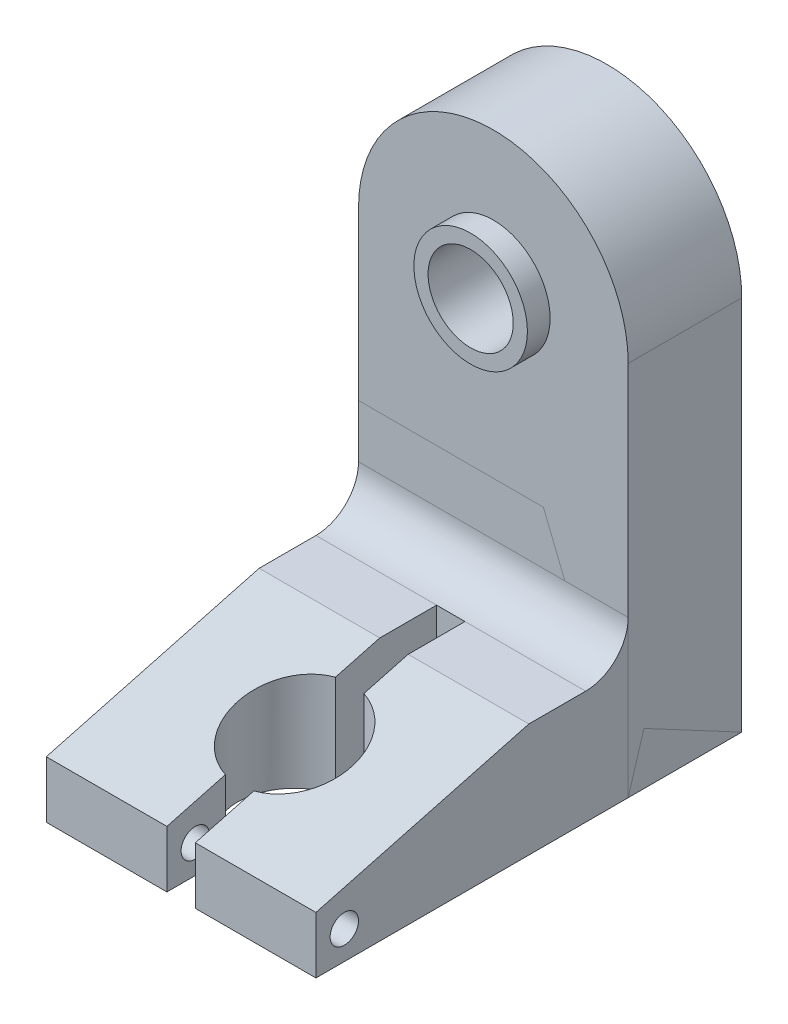
ISO-10303-21;
HEADER;
FILE_DESCRIPTION(('STEP AP214'),'2;1');
FILE_NAME('part.step','',(''),(''),'','','');
FILE_SCHEMA(('AUTOMOTIVE_DESIGN { 1 0 10303 214 1 1 1 1 }'));
ENDSEC;
DATA;
#1=APPLICATION_CONTEXT('core data for automotive mechanical design processes');
#2=APPLICATION_PROTOCOL_DEFINITION('international standard','automotive_design',2000,#1);
#3=PRODUCT_CONTEXT('',#1,'mechanical');
#4=PRODUCT('Part','Part','',(#3));
#5=PRODUCT_RELATED_PRODUCT_CATEGORY('part','',(#4));
#6=PRODUCT_DEFINITION_FORMATION('','',#4);
#7=PRODUCT_DEFINITION_CONTEXT('part definition',#1,'design');
#8=PRODUCT_DEFINITION('design','',#6,#7);
#9=PRODUCT_DEFINITION_SHAPE('','',#8);
#10=(LENGTH_UNIT() NAMED_UNIT(*) SI_UNIT(.MILLI.,.METRE.));
#11=(NAMED_UNIT(*) PLANE_ANGLE_UNIT() SI_UNIT($,.RADIAN.));
#12=(NAMED_UNIT(*) SI_UNIT($,.STERADIAN.) SOLID_ANGLE_UNIT());
#13=UNCERTAINTY_MEASURE_WITH_UNIT(LENGTH_MEASURE(1.E-05),#10,'distance_accuracy_value','');
#14=(GEOMETRIC_REPRESENTATION_CONTEXT(3) GLOBAL_UNCERTAINTY_ASSIGNED_CONTEXT((#13)) GLOBAL_UNIT_ASSIGNED_CONTEXT((#10,
#11,#12)) REPRESENTATION_CONTEXT('',''));
#15=CARTESIAN_POINT('',(0.,0.,0.));
#16=DIRECTION('',(0.,0.,1.));
#17=DIRECTION('',(1.,0.,0.));
#18=AXIS2_PLACEMENT_3D('',#15,#16,#17);
#19=CARTESIAN_POINT('',(47.5,-26.25,40.));
#20=DIRECTION('',(0.,1.,0.));
#21=DIRECTION('',(-1.,0.,0.));
#22=AXIS2_PLACEMENT_3D('',#19,#20,#21);
#23=PLANE('',#22);
#24=DIRECTION('',(0.,0.,-1.));
#25=VECTOR('',#24,1.);
#26=CARTESIAN_POINT('',(5.,-26.25,55.));
#27=LINE('',#26,#25);
#28=CARTESIAN_POINT('',(5.00000000000001,-26.25,75.));
#29=VERTEX_POINT('',#28);
#30=CARTESIAN_POINT('',(5.,-26.25,55.));
#31=VERTEX_POINT('',#30);
#32=EDGE_CURVE('E62',#29,#31,#27,.T.);
#33=ORIENTED_EDGE('',*,*,#32,.F.);
#34=DIRECTION('',(-1.,0.,0.));
#35=VECTOR('',#34,1.);
#36=CARTESIAN_POINT('',(47.5,-26.25,75.));
#37=LINE('',#36,#35);
#38=CARTESIAN_POINT('',(47.5,-26.25,75.));
#39=VERTEX_POINT('',#38);
#40=EDGE_CURVE('E290',#39,#29,#37,.T.);
#41=ORIENTED_EDGE('',*,*,#40,.F.);
#42=DIRECTION('',(0.,0.,-1.));
#43=VECTOR('',#42,1.);
#44=CARTESIAN_POINT('',(47.5,-26.25,40.));
#45=LINE('',#44,#43);
#46=CARTESIAN_POINT('',(47.5,-26.25,55.));
#47=VERTEX_POINT('',#46);
#48=EDGE_CURVE('E324',#39,#47,#45,.T.);
#49=ORIENTED_EDGE('',*,*,#48,.T.);
#50=DIRECTION('',(-1.,0.,0.));
#51=VECTOR('',#50,1.);
#52=CARTESIAN_POINT('',(-47.5,-26.25,55.));
#53=LINE('',#52,#51);
#54=EDGE_CURVE('E200',#47,#31,#53,.T.);
#55=ORIENTED_EDGE('',*,*,#54,.T.);
#56=EDGE_LOOP('',(#33,#41,#49,#55));
#57=FACE_BOUND('',#56,.T.);
#58=ADVANCED_FACE('F46',(#57),#23,.T.);
#59=CARTESIAN_POINT('',(47.5,-26.25,75.));
#60=DIRECTION('',(0.,0.966234939601246,0.257662650560332));
#61=DIRECTION('',(0.,-0.257662650560332,0.966234939601246));
#62=AXIS2_PLACEMENT_3D('',#59,#60,#61);
#63=PLANE('',#62);
#64=DIRECTION('',(0.,0.257662650560332,-0.966234939601246));
#65=VECTOR('',#64,1.);
#66=CARTESIAN_POINT('',(5.,-26.25,75.));
#67=LINE('',#66,#65);
#68=CARTESIAN_POINT('',(5.00000000000001,-30.4193555383901,90.6350832689629));
#69=VERTEX_POINT('',#68);
#70=EDGE_CURVE('E270',#69,#29,#67,.T.);
#71=ORIENTED_EDGE('',*,*,#70,.F.);
#72=CARTESIAN_POINT('',(0.,-35.5833333333333,110.));
#73=DIRECTION('',(0.,0.966234939601246,0.257662650560332));
#74=DIRECTION('',(0.,0.257662650560332,-0.966234939601246));
#75=AXIS2_PLACEMENT_3D('',#72,#73,#74);
#76=ELLIPSE('',#75,20.6988995950134,20.);
#77=CARTESIAN_POINT('',(5.00000000000001,-40.7473111282766,129.364916731037));
#78=VERTEX_POINT('',#77);
#79=EDGE_CURVE('E311',#78,#69,#76,.T.);
#80=ORIENTED_EDGE('',*,*,#79,.F.);
#81=DIRECTION('',(0.,0.257662650560332,-0.966234939601246));
#82=VECTOR('',#81,1.);
#83=CARTESIAN_POINT('',(5.,-26.25,75.));
#84=LINE('',#83,#82);
#85=CARTESIAN_POINT('',(5.00000000000002,-46.25,150.));
#86=VERTEX_POINT('',#85);
#87=EDGE_CURVE('E238',#86,#78,#84,.T.);
#88=ORIENTED_EDGE('',*,*,#87,.F.);
#89=DIRECTION('',(-1.,0.,0.));
#90=VECTOR('',#89,1.);
#91=CARTESIAN_POINT('',(47.5,-46.25,150.));
#92=LINE('',#91,#90);
#93=CARTESIAN_POINT('',(47.5,-46.25,150.));
#94=VERTEX_POINT('',#93);
#95=EDGE_CURVE('E251',#94,#86,#92,.T.);
#96=ORIENTED_EDGE('',*,*,#95,.F.);
#97=DIRECTION('',(0.,0.257662650560332,-0.966234939601246));
#98=VECTOR('',#97,1.);
#99=CARTESIAN_POINT('',(47.5,-26.25,75.));
#100=LINE('',#99,#98);
#101=EDGE_CURVE('E321',#94,#39,#100,.T.);
#102=ORIENTED_EDGE('',*,*,#101,.T.);
#103=ORIENTED_EDGE('',*,*,#40,.T.);
#104=EDGE_LOOP('',(#71,#80,#88,#96,#102,#103));
#105=FACE_BOUND('',#104,.T.);
#106=ADVANCED_FACE('F339',(#105),#63,.T.);
#107=CARTESIAN_POINT('',(47.5,-66.25,150.));
#108=DIRECTION('',(0.,0.,1.));
#109=DIRECTION('',(0.,-1.,0.));
#110=AXIS2_PLACEMENT_3D('',#107,#108,#109);
#111=PLANE('',#110);
#112=DIRECTION('',(0.,1.,0.));
#113=VECTOR('',#112,1.);
#114=CARTESIAN_POINT('',(5.00000000000002,-121.25,150.));
#115=LINE('',#114,#113);
#116=CARTESIAN_POINT('',(5.00000000000002,-66.25,150.));
#117=VERTEX_POINT('',#116);
#118=EDGE_CURVE('E239',#117,#86,#115,.T.);
#119=ORIENTED_EDGE('',*,*,#118,.F.);
#120=DIRECTION('',(-1.,0.,0.));
#121=VECTOR('',#120,1.);
#122=CARTESIAN_POINT('',(47.5,-66.25,150.));
#123=LINE('',#122,#121);
#124=CARTESIAN_POINT('',(47.5,-66.25,150.));
#125=VERTEX_POINT('',#124);
#126=EDGE_CURVE('E208',#125,#117,#123,.T.);
#127=ORIENTED_EDGE('',*,*,#126,.F.);
#128=DIRECTION('',(0.,1.,0.));
#129=VECTOR('',#128,1.);
#130=CARTESIAN_POINT('',(47.5,-66.25,150.));
#131=LINE('',#130,#129);
#132=EDGE_CURVE('E319',#125,#94,#131,.T.);
#133=ORIENTED_EDGE('',*,*,#132,.T.);
#134=ORIENTED_EDGE('',*,*,#95,.T.);
#135=EDGE_LOOP('',(#119,#127,#133,#134));
#136=FACE_BOUND('',#135,.T.);
#137=ADVANCED_FACE('F336',(#136),#111,.T.);
#138=CARTESIAN_POINT('',(47.5,7.44546291799196,0.));
#139=DIRECTION('',(0.,0.,-1.));
#140=DIRECTION('',(-1.,0.,0.));
#141=AXIS2_PLACEMENT_3D('',#138,#139,#140);
#142=PLANE('',#141);
#143=DIRECTION('',(0.,-1.,0.));
#144=VECTOR('',#143,1.);
#145=CARTESIAN_POINT('',(-47.5,7.44546291799196,0.));
#146=LINE('',#145,#144);
#147=CARTESIAN_POINT('',(-47.5,7.44546291799196,0.));
#148=VERTEX_POINT('',#147);
#149=CARTESIAN_POINT('',(-47.5,-66.25,0.));
#150=VERTEX_POINT('',#149);
#151=EDGE_CURVE('E283',#148,#150,#146,.T.);
#152=ORIENTED_EDGE('',*,*,#151,.F.);
#153=DIRECTION('',(-1.,0.,0.));
#154=VECTOR('',#153,1.);
#155=CARTESIAN_POINT('',(47.5,7.44546291799196,0.));
#156=LINE('',#155,#154);
#157=CARTESIAN_POINT('',(47.5,7.44546291799196,0.));
#158=VERTEX_POINT('',#157);
#159=EDGE_CURVE('E204',#158,#148,#156,.T.);
#160=ORIENTED_EDGE('',*,*,#159,.F.);
#161=DIRECTION('',(0.,-1.,0.));
#162=VECTOR('',#161,1.);
#163=CARTESIAN_POINT('',(47.5,7.44546291799196,0.));
#164=LINE('',#163,#162);
#165=CARTESIAN_POINT('',(47.5,-66.25,0.));
#166=VERTEX_POINT('',#165);
#167=EDGE_CURVE('E252',#158,#166,#164,.T.);
#168=ORIENTED_EDGE('',*,*,#167,.T.);
#169=DIRECTION('',(-1.,0.,0.));
#170=VECTOR('',#169,1.);
#171=CARTESIAN_POINT('',(47.5,-66.25,0.));
#172=LINE('',#171,#170);
#173=EDGE_CURVE('E201',#166,#150,#172,.T.);
#174=ORIENTED_EDGE('',*,*,#173,.T.);
#175=EDGE_LOOP('',(#152,#160,#168,#174));
#176=FACE_BOUND('',#175,.T.);
#177=ADVANCED_FACE('F338',(#176),#142,.T.);
#178=CARTESIAN_POINT('',(47.5,7.44546291799196,40.));
#179=DIRECTION('',(0.,1.,0.));
#180=DIRECTION('',(-1.,0.,0.));
#181=AXIS2_PLACEMENT_3D('',#178,#179,#180);
#182=PLANE('',#181);
#183=DIRECTION('',(0.,0.,-1.));
#184=VECTOR('',#183,1.);
#185=CARTESIAN_POINT('',(-47.5,7.44546291799196,40.));
#186=LINE('',#185,#184);
#187=CARTESIAN_POINT('',(-47.5,7.44546291799196,40.));
#188=VERTEX_POINT('',#187);
#189=EDGE_CURVE('E280',#188,#148,#186,.T.);
#190=ORIENTED_EDGE('',*,*,#189,.F.);
#191=DIRECTION('',(-1.,0.,0.));
#192=VECTOR('',#191,1.);
#193=CARTESIAN_POINT('',(47.5,7.44546291799196,40.));
#194=LINE('',#193,#192);
#195=CARTESIAN_POINT('',(47.5,7.44546291799196,40.));
#196=VERTEX_POINT('',#195);
#197=EDGE_CURVE('E287',#196,#188,#194,.T.);
#198=ORIENTED_EDGE('',*,*,#197,.F.);
#199=DIRECTION('',(0.,0.,-1.));
#200=VECTOR('',#199,1.);
#201=CARTESIAN_POINT('',(47.5,7.44546291799196,40.));
#202=LINE('',#201,#200);
#203=EDGE_CURVE('E257',#196,#158,#202,.T.);
#204=ORIENTED_EDGE('',*,*,#203,.T.);
#205=ORIENTED_EDGE('',*,*,#159,.T.);
#206=EDGE_LOOP('',(#190,#198,#204,#205));
#207=FACE_BOUND('',#206,.T.);
#208=ADVANCED_FACE('F332',(#207),#182,.T.);
#209=CARTESIAN_POINT('',(47.5,-26.25,40.));
#210=DIRECTION('',(0.,0.,1.));
#211=DIRECTION('',(1.,0.,0.));
#212=AXIS2_PLACEMENT_3D('',#209,#210,#211);
#213=PLANE('',#212);
#214=DIRECTION('',(0.,1.,0.));
#215=VECTOR('',#214,1.);
#216=CARTESIAN_POINT('',(-47.5,-26.25,40.));
#217=LINE('',#216,#215);
#218=CARTESIAN_POINT('',(-47.5,-11.25,40.));
#219=VERTEX_POINT('',#218);
#220=EDGE_CURVE('E278',#219,#188,#217,.T.);
#221=ORIENTED_EDGE('',*,*,#220,.F.);
#222=DIRECTION('',(-1.,0.,0.));
#223=VECTOR('',#222,1.);
#224=CARTESIAN_POINT('',(47.5,-11.25,40.));
#225=LINE('',#224,#223);
#226=CARTESIAN_POINT('',(47.5,-11.25,40.));
#227=VERTEX_POINT('',#226);
#228=EDGE_CURVE('E70',#219,#227,#225,.F.);
#229=ORIENTED_EDGE('',*,*,#228,.T.);
#230=DIRECTION('',(0.,1.,0.));
#231=VECTOR('',#230,1.);
#232=CARTESIAN_POINT('',(47.5,-26.25,40.));
#233=LINE('',#232,#231);
#234=EDGE_CURVE('E262',#227,#196,#233,.T.);
#235=ORIENTED_EDGE('',*,*,#234,.T.);
#236=ORIENTED_EDGE('',*,*,#197,.T.);
#237=EDGE_LOOP('',(#221,#229,#235,#236));
#238=FACE_BOUND('',#237,.T.);
#239=ADVANCED_FACE('F327',(#238),#213,.T.);
#240=DIRECTION('',(0.,0.,1.));
#241=VECTOR('',#240,1.);
#242=CARTESIAN_POINT('',(-5.,-26.25,90.6350832689629));
#243=LINE('',#242,#241);
#244=CARTESIAN_POINT('',(-5.,-26.25,55.));
#245=VERTEX_POINT('',#244);
#246=CARTESIAN_POINT('',(-5.,-26.25,75.));
#247=VERTEX_POINT('',#246);
#248=EDGE_CURVE('E170',#245,#247,#243,.T.);
#249=ORIENTED_EDGE('',*,*,#248,.F.);
#250=CARTESIAN_POINT('',(-47.5,-26.25,55.));
#251=VERTEX_POINT('',#250);
#252=EDGE_CURVE('E192',#245,#251,#53,.T.);
#253=ORIENTED_EDGE('',*,*,#252,.T.);
#254=DIRECTION('',(0.,0.,-1.));
#255=VECTOR('',#254,1.);
#256=CARTESIAN_POINT('',(-47.5,-26.25,40.));
#257=LINE('',#256,#255);
#258=CARTESIAN_POINT('',(-47.5,-26.25,75.));
#259=VERTEX_POINT('',#258);
#260=EDGE_CURVE('E276',#259,#251,#257,.T.);
#261=ORIENTED_EDGE('',*,*,#260,.F.);
#262=EDGE_CURVE('E194',#247,#259,#37,.T.);
#263=ORIENTED_EDGE('',*,*,#262,.F.);
#264=EDGE_LOOP('',(#249,#253,#261,#263));
#265=FACE_BOUND('',#264,.T.);
#266=ADVANCED_FACE('F190',(#265),#23,.T.);
#267=DIRECTION('',(0.,-0.257662650560332,0.966234939601246));
#268=VECTOR('',#267,1.);
#269=CARTESIAN_POINT('',(-5.,-26.25,75.));
#270=LINE('',#269,#268);
#271=CARTESIAN_POINT('',(-5.,-40.7473111282766,129.364916731037));
#272=VERTEX_POINT('',#271);
#273=CARTESIAN_POINT('',(-5.,-46.25,150.));
#274=VERTEX_POINT('',#273);
#275=EDGE_CURVE('E306',#272,#274,#270,.T.);
#276=ORIENTED_EDGE('',*,*,#275,.F.);
#277=CARTESIAN_POINT('',(0.,-35.5833333333333,110.));
#278=DIRECTION('',(0.,0.966234939601246,0.257662650560332));
#279=DIRECTION('',(0.,0.257662650560332,-0.966234939601246));
#280=AXIS2_PLACEMENT_3D('',#277,#278,#279);
#281=ELLIPSE('',#280,20.6988995950134,20.);
#282=CARTESIAN_POINT('',(-5.,-30.4193555383901,90.6350832689629));
#283=VERTEX_POINT('',#282);
#284=EDGE_CURVE('E307',#283,#272,#281,.T.);
#285=ORIENTED_EDGE('',*,*,#284,.F.);
#286=DIRECTION('',(0.,-0.257662650560332,0.966234939601246));
#287=VECTOR('',#286,1.);
#288=CARTESIAN_POINT('',(-5.,-26.25,75.));
#289=LINE('',#288,#287);
#290=EDGE_CURVE('E299',#247,#283,#289,.T.);
#291=ORIENTED_EDGE('',*,*,#290,.F.);
#292=ORIENTED_EDGE('',*,*,#262,.T.);
#293=DIRECTION('',(0.,0.257662650560332,-0.966234939601246));
#294=VECTOR('',#293,1.);
#295=CARTESIAN_POINT('',(-47.5,-26.25,75.));
#296=LINE('',#295,#294);
#297=CARTESIAN_POINT('',(-47.5,-46.25,150.));
#298=VERTEX_POINT('',#297);
#299=EDGE_CURVE('E273',#298,#259,#296,.T.);
#300=ORIENTED_EDGE('',*,*,#299,.F.);
#301=EDGE_CURVE('E249',#274,#298,#92,.T.);
#302=ORIENTED_EDGE('',*,*,#301,.F.);
#303=EDGE_LOOP('',(#276,#285,#291,#292,#300,#302));
#304=FACE_BOUND('',#303,.T.);
#305=ADVANCED_FACE('F296',(#304),#63,.T.);
#306=DIRECTION('',(0.,1.,0.));
#307=VECTOR('',#306,1.);
#308=CARTESIAN_POINT('',(-4.99999999999999,-121.25,150.));
#309=LINE('',#308,#307);
#310=CARTESIAN_POINT('',(-4.99999999999999,-66.25,150.));
#311=VERTEX_POINT('',#310);
#312=EDGE_CURVE('E305',#311,#274,#309,.T.);
#313=ORIENTED_EDGE('',*,*,#312,.T.);
#314=ORIENTED_EDGE('',*,*,#301,.T.);
#315=DIRECTION('',(0.,1.,0.));
#316=VECTOR('',#315,1.);
#317=CARTESIAN_POINT('',(-47.5,-66.25,150.));
#318=LINE('',#317,#316);
#319=CARTESIAN_POINT('',(-47.5,-66.25,150.));
#320=VERTEX_POINT('',#319);
#321=EDGE_CURVE('E269',#320,#298,#318,.T.);
#322=ORIENTED_EDGE('',*,*,#321,.F.);
#323=EDGE_CURVE('E250',#311,#320,#123,.T.);
#324=ORIENTED_EDGE('',*,*,#323,.F.);
#325=EDGE_LOOP('',(#313,#314,#322,#324));
#326=FACE_BOUND('',#325,.T.);
#327=ADVANCED_FACE('F304',(#326),#111,.T.);
#328=CARTESIAN_POINT('',(47.5,-66.25,40.));
#329=DIRECTION('',(0.,-1.,0.));
#330=DIRECTION('',(1.,0.,0.));
#331=AXIS2_PLACEMENT_3D('',#328,#329,#330);
#332=PLANE('',#331);
#333=DIRECTION('',(0.,0.,1.));
#334=VECTOR('',#333,1.);
#335=CARTESIAN_POINT('',(5.,-66.25,40.));
#336=LINE('',#335,#334);
#337=CARTESIAN_POINT('',(5.00000000000002,-66.25,129.364916731037));
#338=VERTEX_POINT('',#337);
#339=EDGE_CURVE('E12',#338,#117,#336,.T.);
#340=ORIENTED_EDGE('',*,*,#339,.F.);
#341=CARTESIAN_POINT('',(0.,-66.25,110.));
#342=DIRECTION('',(0.,-1.,0.));
#343=DIRECTION('',(1.,0.,0.));
#344=AXIS2_PLACEMENT_3D('',#341,#342,#343);
#345=CIRCLE('',#344,20.);
#346=CARTESIAN_POINT('',(5.00000000000001,-66.25,90.6350832689629));
#347=VERTEX_POINT('',#346);
#348=EDGE_CURVE('E55',#347,#338,#345,.T.);
#349=ORIENTED_EDGE('',*,*,#348,.F.);
#350=DIRECTION('',(0.,0.,1.));
#351=VECTOR('',#350,1.);
#352=CARTESIAN_POINT('',(5.,-66.25,40.));
#353=LINE('',#352,#351);
#354=CARTESIAN_POINT('',(5.00000000000001,-66.25,55.));
#355=VERTEX_POINT('',#354);
#356=EDGE_CURVE('E219',#355,#347,#353,.T.);
#357=ORIENTED_EDGE('',*,*,#356,.F.);
#358=DIRECTION('',(1.,0.,0.));
#359=VECTOR('',#358,1.);
#360=CARTESIAN_POINT('',(47.5,-66.25,54.9999999999999));
#361=LINE('',#360,#359);
#362=CARTESIAN_POINT('',(-4.99999999999999,-66.25,55.));
#363=VERTEX_POINT('',#362);
#364=EDGE_CURVE('E413',#363,#355,#361,.T.);
#365=ORIENTED_EDGE('',*,*,#364,.F.);
#366=DIRECTION('',(0.,0.,-1.));
#367=VECTOR('',#366,1.);
#368=CARTESIAN_POINT('',(-5.,-66.25,40.));
#369=LINE('',#368,#367);
#370=CARTESIAN_POINT('',(-4.99999999999999,-66.25,90.6350832689629));
#371=VERTEX_POINT('',#370);
#372=EDGE_CURVE('E174',#371,#363,#369,.T.);
#373=ORIENTED_EDGE('',*,*,#372,.F.);
#374=CARTESIAN_POINT('',(0.,-66.25,110.));
#375=DIRECTION('',(0.,-1.,0.));
#376=DIRECTION('',(1.,0.,0.));
#377=AXIS2_PLACEMENT_3D('',#374,#375,#376);
#378=CIRCLE('',#377,20.);
#379=CARTESIAN_POINT('',(-4.99999999999999,-66.25,129.364916731037));
#380=VERTEX_POINT('',#379);
#381=EDGE_CURVE('E215',#380,#371,#378,.T.);
#382=ORIENTED_EDGE('',*,*,#381,.F.);
#383=DIRECTION('',(0.,0.,-1.));
#384=VECTOR('',#383,1.);
#385=CARTESIAN_POINT('',(-5.,-66.25,40.));
#386=LINE('',#385,#384);
#387=EDGE_CURVE('E217',#311,#380,#386,.T.);
#388=ORIENTED_EDGE('',*,*,#387,.F.);
#389=ORIENTED_EDGE('',*,*,#323,.T.);
#390=DIRECTION('',(0.,0.,1.));
#391=VECTOR('',#390,1.);
#392=CARTESIAN_POINT('',(-47.5,-66.25,40.));
#393=LINE('',#392,#391);
#394=EDGE_CURVE('E266',#150,#320,#393,.T.);
#395=ORIENTED_EDGE('',*,*,#394,.F.);
#396=ORIENTED_EDGE('',*,*,#173,.F.);
#397=DIRECTION('',(0.,0.,1.));
#398=VECTOR('',#397,1.);
#399=CARTESIAN_POINT('',(47.5,-66.25,0.));
#400=LINE('',#399,#398);
#401=EDGE_CURVE('E245',#166,#125,#400,.T.);
#402=ORIENTED_EDGE('',*,*,#401,.T.);
#403=ORIENTED_EDGE('',*,*,#126,.T.);
#404=EDGE_LOOP('',(#340,#349,#357,#365,#373,#382,#388,#389,#395,#396,#402,#403));
#405=FACE_BOUND('',#404,.T.);
#406=ADVANCED_FACE('F242',(#405),#332,.T.);
#407=CARTESIAN_POINT('',(47.5,0.,0.));
#408=DIRECTION('',(-1.,0.,0.));
#409=DIRECTION('',(0.,0.,1.));
#410=AXIS2_PLACEMENT_3D('',#407,#408,#409);
#411=PLANE('',#410);
#412=CARTESIAN_POINT('',(47.5,-56.25,140.));
#413=DIRECTION('',(1.,0.,0.));
#414=DIRECTION('',(0.,0.,-1.));
#415=AXIS2_PLACEMENT_3D('',#412,#413,#414);
#416=CIRCLE('',#415,4.99999999999999);
#417=CARTESIAN_POINT('',(47.5,-56.25,135.));
#418=VERTEX_POINT('',#417);
#419=EDGE_CURVE('E402',#418,#418,#416,.T.);
#420=ORIENTED_EDGE('',*,*,#419,.F.);
#421=EDGE_LOOP('',(#420));
#422=FACE_BOUND('',#421,.T.);
#423=ORIENTED_EDGE('',*,*,#401,.F.);
#424=ORIENTED_EDGE('',*,*,#167,.F.);
#425=ORIENTED_EDGE('',*,*,#203,.F.);
#426=ORIENTED_EDGE('',*,*,#234,.F.);
#427=CARTESIAN_POINT('',(47.5,-11.25,55.));
#428=DIRECTION('',(-1.,0.,0.));
#429=DIRECTION('',(0.,0.,1.));
#430=AXIS2_PLACEMENT_3D('',#427,#428,#429);
#431=CIRCLE('',#430,15.);
#432=EDGE_CURVE('E212',#227,#47,#431,.T.);
#433=ORIENTED_EDGE('',*,*,#432,.T.);
#434=ORIENTED_EDGE('',*,*,#48,.F.);
#435=ORIENTED_EDGE('',*,*,#101,.F.);
#436=ORIENTED_EDGE('',*,*,#132,.F.);
#437=EDGE_LOOP('',(#423,#424,#425,#426,#433,#434,#435,#436));
#438=FACE_BOUND('',#437,.T.);
#439=ADVANCED_FACE('F333',(#422,#438),#411,.F.);
#440=CARTESIAN_POINT('',(-47.5,0.,0.));
#441=DIRECTION('',(-1.,0.,0.));
#442=DIRECTION('',(0.,0.,1.));
#443=AXIS2_PLACEMENT_3D('',#440,#441,#442);
#444=PLANE('',#443);
#445=CARTESIAN_POINT('',(-47.5,-56.25,140.));
#446=DIRECTION('',(1.,0.,0.));
#447=DIRECTION('',(0.,0.,-1.));
#448=AXIS2_PLACEMENT_3D('',#445,#446,#447);
#449=CIRCLE('',#448,4.99999999999999);
#450=CARTESIAN_POINT('',(-47.5,-56.25,135.));
#451=VERTEX_POINT('',#450);
#452=EDGE_CURVE('E407',#451,#451,#449,.T.);
#453=ORIENTED_EDGE('',*,*,#452,.T.);
#454=EDGE_LOOP('',(#453));
#455=FACE_BOUND('',#454,.T.);
#456=ORIENTED_EDGE('',*,*,#151,.T.);
#457=ORIENTED_EDGE('',*,*,#394,.T.);
#458=ORIENTED_EDGE('',*,*,#321,.T.);
#459=ORIENTED_EDGE('',*,*,#299,.T.);
#460=ORIENTED_EDGE('',*,*,#260,.T.);
#461=CARTESIAN_POINT('',(-47.5,-11.25,55.));
#462=DIRECTION('',(-1.,0.,0.));
#463=DIRECTION('',(0.,0.,1.));
#464=AXIS2_PLACEMENT_3D('',#461,#462,#463);
#465=CIRCLE('',#464,15.);
#466=EDGE_CURVE('E198',#251,#219,#465,.F.);
#467=ORIENTED_EDGE('',*,*,#466,.T.);
#468=ORIENTED_EDGE('',*,*,#220,.T.);
#469=ORIENTED_EDGE('',*,*,#189,.T.);
#470=EDGE_LOOP('',(#456,#457,#458,#459,#460,#467,#468,#469));
#471=FACE_BOUND('',#470,.T.);
#472=ADVANCED_FACE('F301',(#455,#471),#444,.T.);
#473=CARTESIAN_POINT('',(47.5,-11.25,55.));
#474=DIRECTION('',(1.,0.,0.));
#475=DIRECTION('',(0.,1.,0.));
#476=AXIS2_PLACEMENT_3D('',#473,#474,#475);
#477=CYLINDRICAL_SURFACE('',#476,15.);
#478=ORIENTED_EDGE('',*,*,#432,.F.);
#479=ORIENTED_EDGE('',*,*,#228,.F.);
#480=ORIENTED_EDGE('',*,*,#466,.F.);
#481=ORIENTED_EDGE('',*,*,#252,.F.);
#482=DIRECTION('',(-1.,0.,0.));
#483=VECTOR('',#482,1.);
#484=CARTESIAN_POINT('',(0.,-26.25,55.));
#485=LINE('',#484,#483);
#486=EDGE_CURVE('E178',#31,#245,#485,.T.);
#487=ORIENTED_EDGE('',*,*,#486,.F.);
#488=ORIENTED_EDGE('',*,*,#54,.F.);
#489=EDGE_LOOP('',(#478,#479,#480,#481,#487,#488));
#490=FACE_BOUND('',#489,.T.);
#491=ADVANCED_FACE('F48',(#490),#477,.F.);
#492=CARTESIAN_POINT('',(0.,-121.25,55.));
#493=DIRECTION('',(0.,0.,-1.));
#494=DIRECTION('',(-1.,0.,0.));
#495=AXIS2_PLACEMENT_3D('',#492,#493,#494);
#496=PLANE('',#495);
#497=ORIENTED_EDGE('',*,*,#364,.T.);
#498=DIRECTION('',(0.,1.,0.));
#499=VECTOR('',#498,1.);
#500=CARTESIAN_POINT('',(5.00000000000001,-121.25,55.));
#501=LINE('',#500,#499);
#502=EDGE_CURVE('E182',#355,#31,#501,.T.);
#503=ORIENTED_EDGE('',*,*,#502,.T.);
#504=ORIENTED_EDGE('',*,*,#486,.T.);
#505=DIRECTION('',(0.,1.,0.));
#506=VECTOR('',#505,1.);
#507=CARTESIAN_POINT('',(-4.99999999999999,-121.25,55.));
#508=LINE('',#507,#506);
#509=EDGE_CURVE('E166',#363,#245,#508,.T.);
#510=ORIENTED_EDGE('',*,*,#509,.F.);
#511=EDGE_LOOP('',(#497,#503,#504,#510));
#512=FACE_BOUND('',#511,.T.);
#513=ADVANCED_FACE('F181',(#512),#496,.F.);
#514=CARTESIAN_POINT('',(5.00000000000001,-121.25,55.));
#515=DIRECTION('',(1.,0.,0.));
#516=DIRECTION('',(0.,0.,-1.));
#517=AXIS2_PLACEMENT_3D('',#514,#515,#516);
#518=PLANE('',#517);
#519=ORIENTED_EDGE('',*,*,#70,.T.);
#520=ORIENTED_EDGE('',*,*,#32,.T.);
#521=ORIENTED_EDGE('',*,*,#502,.F.);
#522=ORIENTED_EDGE('',*,*,#356,.T.);
#523=DIRECTION('',(0.,1.,0.));
#524=VECTOR('',#523,1.);
#525=CARTESIAN_POINT('',(5.00000000000002,-121.25,90.6350832689629));
#526=LINE('',#525,#524);
#527=EDGE_CURVE('E230',#347,#69,#526,.T.);
#528=ORIENTED_EDGE('',*,*,#527,.T.);
#529=EDGE_LOOP('',(#519,#520,#521,#522,#528));
#530=FACE_BOUND('',#529,.T.);
#531=ADVANCED_FACE('F387',(#530),#518,.F.);
#532=CARTESIAN_POINT('',(0.,-121.25,110.));
#533=DIRECTION('',(0.,1.,0.));
#534=DIRECTION('',(-1.,0.,0.));
#535=AXIS2_PLACEMENT_3D('',#532,#533,#534);
#536=CYLINDRICAL_SURFACE('',#535,20.);
#537=ORIENTED_EDGE('',*,*,#79,.T.);
#538=ORIENTED_EDGE('',*,*,#527,.F.);
#539=ORIENTED_EDGE('',*,*,#348,.T.);
#540=DIRECTION('',(0.,1.,0.));
#541=VECTOR('',#540,1.);
#542=CARTESIAN_POINT('',(5.00000000000002,-121.25,129.364916731037));
#543=LINE('',#542,#541);
#544=EDGE_CURVE('E227',#338,#78,#543,.T.);
#545=ORIENTED_EDGE('',*,*,#544,.T.);
#546=EDGE_LOOP('',(#537,#538,#539,#545));
#547=FACE_BOUND('',#546,.T.);
#548=ADVANCED_FACE('F226',(#547),#536,.F.);
#549=CARTESIAN_POINT('',(5.00000000000002,-121.25,129.364916731037));
#550=DIRECTION('',(1.,0.,0.));
#551=DIRECTION('',(0.,0.,-1.));
#552=AXIS2_PLACEMENT_3D('',#549,#550,#551);
#553=PLANE('',#552);
#554=CARTESIAN_POINT('',(5.00000000000001,-56.25,140.));
#555=DIRECTION('',(1.,0.,0.));
#556=DIRECTION('',(0.,0.,-1.));
#557=AXIS2_PLACEMENT_3D('',#554,#555,#556);
#558=CIRCLE('',#557,4.99999999999999);
#559=CARTESIAN_POINT('',(5.00000000000001,-56.25,135.));
#560=VERTEX_POINT('',#559);
#561=EDGE_CURVE('E195',#560,#560,#558,.T.);
#562=ORIENTED_EDGE('',*,*,#561,.T.);
#563=EDGE_LOOP('',(#562));
#564=FACE_BOUND('',#563,.T.);
#565=ORIENTED_EDGE('',*,*,#87,.T.);
#566=ORIENTED_EDGE('',*,*,#544,.F.);
#567=ORIENTED_EDGE('',*,*,#339,.T.);
#568=ORIENTED_EDGE('',*,*,#118,.T.);
#569=EDGE_LOOP('',(#565,#566,#567,#568));
#570=FACE_BOUND('',#569,.T.);
#571=ADVANCED_FACE('F235',(#564,#570),#553,.F.);
#572=CARTESIAN_POINT('',(-4.99999999999999,-121.25,150.));
#573=DIRECTION('',(-1.,0.,0.));
#574=DIRECTION('',(0.,-1.,0.));
#575=AXIS2_PLACEMENT_3D('',#572,#573,#574);
#576=PLANE('',#575);
#577=CARTESIAN_POINT('',(-5.,-56.25,140.));
#578=DIRECTION('',(-1.,0.,0.));
#579=DIRECTION('',(0.,-1.,0.));
#580=AXIS2_PLACEMENT_3D('',#577,#578,#579);
#581=CIRCLE('',#580,4.99999999999999);
#582=CARTESIAN_POINT('',(-5.,-61.25,140.));
#583=VERTEX_POINT('',#582);
#584=EDGE_CURVE('E50',#583,#583,#581,.T.);
#585=ORIENTED_EDGE('',*,*,#584,.T.);
#586=EDGE_LOOP('',(#585));
#587=FACE_BOUND('',#586,.T.);
#588=ORIENTED_EDGE('',*,*,#275,.T.);
#589=ORIENTED_EDGE('',*,*,#312,.F.);
#590=ORIENTED_EDGE('',*,*,#387,.T.);
#591=DIRECTION('',(0.,1.,0.));
#592=VECTOR('',#591,1.);
#593=CARTESIAN_POINT('',(-4.99999999999999,-121.25,129.364916731037));
#594=LINE('',#593,#592);
#595=EDGE_CURVE('E417',#380,#272,#594,.T.);
#596=ORIENTED_EDGE('',*,*,#595,.T.);
#597=EDGE_LOOP('',(#588,#589,#590,#596));
#598=FACE_BOUND('',#597,.T.);
#599=ADVANCED_FACE('F377',(#587,#598),#576,.F.);
#600=CARTESIAN_POINT('',(0.,-121.25,110.));
#601=DIRECTION('',(0.,1.,0.));
#602=DIRECTION('',(-1.,0.,0.));
#603=AXIS2_PLACEMENT_3D('',#600,#601,#602);
#604=CYLINDRICAL_SURFACE('',#603,20.);
#605=ORIENTED_EDGE('',*,*,#284,.T.);
#606=ORIENTED_EDGE('',*,*,#595,.F.);
#607=ORIENTED_EDGE('',*,*,#381,.T.);
#608=DIRECTION('',(0.,1.,0.));
#609=VECTOR('',#608,1.);
#610=CARTESIAN_POINT('',(-4.99999999999998,-121.25,90.6350832689629));
#611=LINE('',#610,#609);
#612=EDGE_CURVE('E177',#371,#283,#611,.T.);
#613=ORIENTED_EDGE('',*,*,#612,.T.);
#614=EDGE_LOOP('',(#605,#606,#607,#613));
#615=FACE_BOUND('',#614,.T.);
#616=ADVANCED_FACE('F374',(#615),#604,.F.);
#617=CARTESIAN_POINT('',(-4.99999999999999,-121.25,90.6350832689629));
#618=DIRECTION('',(-1.,0.,0.));
#619=DIRECTION('',(0.,-1.,0.));
#620=AXIS2_PLACEMENT_3D('',#617,#618,#619);
#621=PLANE('',#620);
#622=ORIENTED_EDGE('',*,*,#290,.T.);
#623=ORIENTED_EDGE('',*,*,#612,.F.);
#624=ORIENTED_EDGE('',*,*,#372,.T.);
#625=ORIENTED_EDGE('',*,*,#509,.T.);
#626=ORIENTED_EDGE('',*,*,#248,.T.);
#627=EDGE_LOOP('',(#622,#623,#624,#625,#626));
#628=FACE_BOUND('',#627,.T.);
#629=ADVANCED_FACE('F168',(#628),#621,.F.);
#630=CARTESIAN_POINT('',(-47.5,-56.25,140.));
#631=DIRECTION('',(1.,0.,0.));
#632=DIRECTION('',(0.,0.,-1.));
#633=AXIS2_PLACEMENT_3D('',#630,#631,#632);
#634=CYLINDRICAL_SURFACE('',#633,4.99999999999999);
#635=ORIENTED_EDGE('',*,*,#452,.F.);
#636=EDGE_LOOP('',(#635));
#637=FACE_BOUND('',#636,.T.);
#638=ORIENTED_EDGE('',*,*,#584,.F.);
#639=EDGE_LOOP('',(#638));
#640=FACE_BOUND('',#639,.T.);
#641=ADVANCED_FACE('F373',(#637,#640),#634,.F.);
#642=ORIENTED_EDGE('',*,*,#419,.T.);
#643=EDGE_LOOP('',(#642));
#644=FACE_BOUND('',#643,.T.);
#645=ORIENTED_EDGE('',*,*,#561,.F.);
#646=EDGE_LOOP('',(#645));
#647=FACE_BOUND('',#646,.T.);
#648=ADVANCED_FACE('F392',(#644,#647),#634,.F.);
#649=CLOSED_SHELL('',(#58,#106,#137,#177,#208,#239,#266,#305,#327,#406,#439,#472,#491,#513,#531,
#548,#571,#599,#616,#629,#641,#648));
#650=MANIFOLD_SOLID_BREP('B2',#649);
#651=CARTESIAN_POINT('',(0.,66.25,40.));
#652=DIRECTION('',(0.,0.,1.));
#653=DIRECTION('',(1.,0.,0.));
#654=AXIS2_PLACEMENT_3D('',#651,#652,#653);
#655=PLANE('',#654);
#656=DIRECTION('',(0.,1.,0.));
#657=VECTOR('',#656,1.);
#658=CARTESIAN_POINT('',(47.5,66.25,40.));
#659=LINE('',#658,#657);
#660=CARTESIAN_POINT('',(47.5,-66.25,40.));
#661=VERTEX_POINT('',#660);
#662=CARTESIAN_POINT('',(47.5,66.25,40.));
#663=VERTEX_POINT('',#662);
#664=EDGE_CURVE('E613',#661,#663,#659,.T.);
#665=ORIENTED_EDGE('',*,*,#664,.T.);
#666=CARTESIAN_POINT('',(0.,66.25,40.));
#667=DIRECTION('',(0.,0.,1.));
#668=DIRECTION('',(1.,0.,0.));
#669=AXIS2_PLACEMENT_3D('',#666,#667,#668);
#670=CIRCLE('',#669,47.5);
#671=CARTESIAN_POINT('',(-47.5,66.25,40.));
#672=VERTEX_POINT('',#671);
#673=EDGE_CURVE('E608',#663,#672,#670,.T.);
#674=ORIENTED_EDGE('',*,*,#673,.T.);
#675=DIRECTION('',(0.,-1.,0.));
#676=VECTOR('',#675,1.);
#677=CARTESIAN_POINT('',(-47.5,66.25,40.));
#678=LINE('',#677,#676);
#679=CARTESIAN_POINT('',(-47.5,-66.25,40.));
#680=VERTEX_POINT('',#679);
#681=EDGE_CURVE('E611',#672,#680,#678,.T.);
#682=ORIENTED_EDGE('',*,*,#681,.T.);
#683=DIRECTION('',(1.,0.,0.));
#684=VECTOR('',#683,1.);
#685=CARTESIAN_POINT('',(-47.5,-66.25,40.));
#686=LINE('',#685,#684);
#687=EDGE_CURVE('E578',#680,#661,#686,.T.);
#688=ORIENTED_EDGE('',*,*,#687,.T.);
#689=EDGE_LOOP('',(#665,#674,#682,#688));
#690=FACE_BOUND('',#689,.T.);
#691=CARTESIAN_POINT('',(0.,66.25,40.));
#692=DIRECTION('',(0.,0.,1.));
#693=DIRECTION('',(1.,0.,0.));
#694=AXIS2_PLACEMENT_3D('',#691,#692,#693);
#695=CIRCLE('',#694,20.);
#696=CARTESIAN_POINT('',(20.,66.25,40.));
#697=VERTEX_POINT('',#696);
#698=EDGE_CURVE('E643',#697,#697,#695,.T.);
#699=ORIENTED_EDGE('',*,*,#698,.F.);
#700=EDGE_LOOP('',(#699));
#701=FACE_BOUND('',#700,.T.);
#702=ADVANCED_FACE('F561',(#690,#701),#655,.T.);
#703=CARTESIAN_POINT('',(0.,66.25,0.));
#704=DIRECTION('',(0.,0.,1.));
#705=DIRECTION('',(1.,0.,0.));
#706=AXIS2_PLACEMENT_3D('',#703,#704,#705);
#707=PLANE('',#706);
#708=DIRECTION('',(0.,1.,0.));
#709=VECTOR('',#708,1.);
#710=CARTESIAN_POINT('',(47.5,66.25,0.));
#711=LINE('',#710,#709);
#712=CARTESIAN_POINT('',(47.5,-66.25,0.));
#713=VERTEX_POINT('',#712);
#714=CARTESIAN_POINT('',(47.5,66.25,0.));
#715=VERTEX_POINT('',#714);
#716=EDGE_CURVE('E625',#713,#715,#711,.T.);
#717=ORIENTED_EDGE('',*,*,#716,.F.);
#718=DIRECTION('',(1.,0.,0.));
#719=VECTOR('',#718,1.);
#720=CARTESIAN_POINT('',(-47.5,-66.25,0.));
#721=LINE('',#720,#719);
#722=CARTESIAN_POINT('',(-47.5,-66.25,0.));
#723=VERTEX_POINT('',#722);
#724=EDGE_CURVE('E601',#723,#713,#721,.T.);
#725=ORIENTED_EDGE('',*,*,#724,.F.);
#726=DIRECTION('',(0.,-1.,0.));
#727=VECTOR('',#726,1.);
#728=CARTESIAN_POINT('',(-47.5,66.25,0.));
#729=LINE('',#728,#727);
#730=CARTESIAN_POINT('',(-47.5,66.25,0.));
#731=VERTEX_POINT('',#730);
#732=EDGE_CURVE('E595',#731,#723,#729,.T.);
#733=ORIENTED_EDGE('',*,*,#732,.F.);
#734=CARTESIAN_POINT('',(0.,66.25,0.));
#735=DIRECTION('',(0.,0.,1.));
#736=DIRECTION('',(1.,0.,0.));
#737=AXIS2_PLACEMENT_3D('',#734,#735,#736);
#738=CIRCLE('',#737,47.5);
#739=EDGE_CURVE('E617',#715,#731,#738,.T.);
#740=ORIENTED_EDGE('',*,*,#739,.F.);
#741=EDGE_LOOP('',(#717,#725,#733,#740));
#742=FACE_BOUND('',#741,.T.);
#743=CARTESIAN_POINT('',(0.,66.25,0.));
#744=DIRECTION('',(0.,0.,1.));
#745=DIRECTION('',(1.,0.,0.));
#746=AXIS2_PLACEMENT_3D('',#743,#744,#745);
#747=CIRCLE('',#746,15.);
#748=CARTESIAN_POINT('',(15.,66.25,0.));
#749=VERTEX_POINT('',#748);
#750=EDGE_CURVE('E628',#749,#749,#747,.T.);
#751=ORIENTED_EDGE('',*,*,#750,.T.);
#752=EDGE_LOOP('',(#751));
#753=FACE_BOUND('',#752,.T.);
#754=ADVANCED_FACE('F636',(#742,#753),#707,.F.);
#755=CARTESIAN_POINT('',(47.5,66.25,40.));
#756=DIRECTION('',(-1.,0.,0.));
#757=DIRECTION('',(0.,-1.,0.));
#758=AXIS2_PLACEMENT_3D('',#755,#756,#757);
#759=PLANE('',#758);
#760=ORIENTED_EDGE('',*,*,#716,.T.);
#761=DIRECTION('',(0.,0.,-1.));
#762=VECTOR('',#761,1.);
#763=CARTESIAN_POINT('',(47.5,66.25,40.));
#764=LINE('',#763,#762);
#765=EDGE_CURVE('E44',#663,#715,#764,.T.);
#766=ORIENTED_EDGE('',*,*,#765,.F.);
#767=ORIENTED_EDGE('',*,*,#664,.F.);
#768=DIRECTION('',(0.,0.,-1.));
#769=VECTOR('',#768,1.);
#770=CARTESIAN_POINT('',(47.5,-66.25,40.));
#771=LINE('',#770,#769);
#772=EDGE_CURVE('E621',#661,#713,#771,.T.);
#773=ORIENTED_EDGE('',*,*,#772,.T.);
#774=EDGE_LOOP('',(#760,#766,#767,#773));
#775=FACE_BOUND('',#774,.T.);
#776=ADVANCED_FACE('F563',(#775),#759,.F.);
#777=CARTESIAN_POINT('',(0.,66.25,40.));
#778=DIRECTION('',(0.,0.,-1.));
#779=DIRECTION('',(-1.,0.,0.));
#780=AXIS2_PLACEMENT_3D('',#777,#778,#779);
#781=CYLINDRICAL_SURFACE('',#780,47.5);
#782=ORIENTED_EDGE('',*,*,#739,.T.);
#783=DIRECTION('',(0.,0.,-1.));
#784=VECTOR('',#783,1.);
#785=CARTESIAN_POINT('',(-47.5,66.25,40.));
#786=LINE('',#785,#784);
#787=EDGE_CURVE('E570',#672,#731,#786,.T.);
#788=ORIENTED_EDGE('',*,*,#787,.F.);
#789=ORIENTED_EDGE('',*,*,#673,.F.);
#790=ORIENTED_EDGE('',*,*,#765,.T.);
#791=EDGE_LOOP('',(#782,#788,#789,#790));
#792=FACE_BOUND('',#791,.T.);
#793=ADVANCED_FACE('F616',(#792),#781,.T.);
#794=CARTESIAN_POINT('',(-47.5,66.25,40.));
#795=DIRECTION('',(1.,0.,0.));
#796=DIRECTION('',(0.,1.,0.));
#797=AXIS2_PLACEMENT_3D('',#794,#795,#796);
#798=PLANE('',#797);
#799=ORIENTED_EDGE('',*,*,#732,.T.);
#800=DIRECTION('',(0.,0.,-1.));
#801=VECTOR('',#800,1.);
#802=CARTESIAN_POINT('',(-47.5,-66.25,40.));
#803=LINE('',#802,#801);
#804=EDGE_CURVE('E618',#680,#723,#803,.T.);
#805=ORIENTED_EDGE('',*,*,#804,.F.);
#806=ORIENTED_EDGE('',*,*,#681,.F.);
#807=ORIENTED_EDGE('',*,*,#787,.T.);
#808=EDGE_LOOP('',(#799,#805,#806,#807));
#809=FACE_BOUND('',#808,.T.);
#810=ADVANCED_FACE('F619',(#809),#798,.F.);
#811=CARTESIAN_POINT('',(-47.5,-66.25,40.));
#812=DIRECTION('',(0.,1.,0.));
#813=DIRECTION('',(0.,0.,1.));
#814=AXIS2_PLACEMENT_3D('',#811,#812,#813);
#815=PLANE('',#814);
#816=ORIENTED_EDGE('',*,*,#724,.T.);
#817=ORIENTED_EDGE('',*,*,#772,.F.);
#818=ORIENTED_EDGE('',*,*,#687,.F.);
#819=ORIENTED_EDGE('',*,*,#804,.T.);
#820=EDGE_LOOP('',(#816,#817,#818,#819));
#821=FACE_BOUND('',#820,.T.);
#822=ADVANCED_FACE('F633',(#821),#815,.F.);
#823=CARTESIAN_POINT('',(0.,66.25,40.));
#824=DIRECTION('',(0.,0.,-1.));
#825=DIRECTION('',(-1.,0.,0.));
#826=AXIS2_PLACEMENT_3D('',#823,#824,#825);
#827=CYLINDRICAL_SURFACE('',#826,15.);
#828=ORIENTED_EDGE('',*,*,#750,.F.);
#829=EDGE_LOOP('',(#828));
#830=FACE_BOUND('',#829,.T.);
#831=CARTESIAN_POINT('',(0.,66.25,48.));
#832=DIRECTION('',(0.,0.,1.));
#833=DIRECTION('',(1.,0.,0.));
#834=AXIS2_PLACEMENT_3D('',#831,#832,#833);
#835=CIRCLE('',#834,15.);
#836=CARTESIAN_POINT('',(15.,66.25,48.));
#837=VERTEX_POINT('',#836);
#838=EDGE_CURVE('E646',#837,#837,#835,.T.);
#839=ORIENTED_EDGE('',*,*,#838,.T.);
#840=EDGE_LOOP('',(#839));
#841=FACE_BOUND('',#840,.T.);
#842=ADVANCED_FACE('F652',(#830,#841),#827,.F.);
#843=CARTESIAN_POINT('',(0.,66.25,48.));
#844=DIRECTION('',(0.,0.,1.));
#845=DIRECTION('',(1.,0.,0.));
#846=AXIS2_PLACEMENT_3D('',#843,#844,#845);
#847=PLANE('',#846);
#848=CARTESIAN_POINT('',(0.,66.25,48.));
#849=DIRECTION('',(0.,0.,1.));
#850=DIRECTION('',(1.,0.,0.));
#851=AXIS2_PLACEMENT_3D('',#848,#849,#850);
#852=CIRCLE('',#851,20.);
#853=CARTESIAN_POINT('',(20.,66.25,48.));
#854=VERTEX_POINT('',#853);
#855=EDGE_CURVE('E642',#854,#854,#852,.T.);
#856=ORIENTED_EDGE('',*,*,#855,.T.);
#857=EDGE_LOOP('',(#856));
#858=FACE_BOUND('',#857,.T.);
#859=ORIENTED_EDGE('',*,*,#838,.F.);
#860=EDGE_LOOP('',(#859));
#861=FACE_BOUND('',#860,.T.);
#862=ADVANCED_FACE('F654',(#858,#861),#847,.T.);
#863=CARTESIAN_POINT('',(0.,66.25,48.));
#864=DIRECTION('',(0.,0.,-1.));
#865=DIRECTION('',(-1.,0.,0.));
#866=AXIS2_PLACEMENT_3D('',#863,#864,#865);
#867=CYLINDRICAL_SURFACE('',#866,20.);
#868=ORIENTED_EDGE('',*,*,#855,.F.);
#869=EDGE_LOOP('',(#868));
#870=FACE_BOUND('',#869,.T.);
#871=ORIENTED_EDGE('',*,*,#698,.T.);
#872=EDGE_LOOP('',(#871));
#873=FACE_BOUND('',#872,.T.);
#874=ADVANCED_FACE('F656',(#870,#873),#867,.T.);
#875=CLOSED_SHELL('',(#702,#754,#776,#793,#810,#822,#842,#862,#874));
#876=MANIFOLD_SOLID_BREP('B6',#875);
#877=ADVANCED_BREP_SHAPE_REPRESENTATION('',(#18,#650,#876),#14);
#878=SHAPE_DEFINITION_REPRESENTATION(#9,#877);
ENDSEC;
END-ISO-10303-21;
